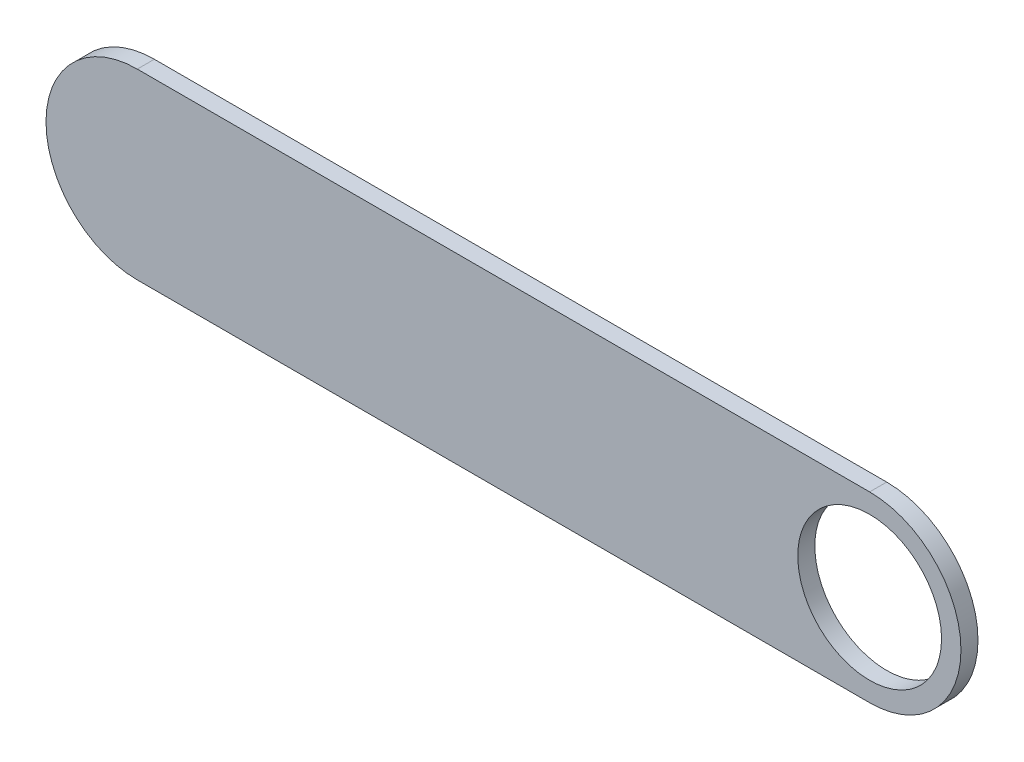
ISO-10303-21;
HEADER;
FILE_DESCRIPTION(('STEP AP214'),'2;1');
FILE_NAME('part.step','',(''),(''),'','','');
FILE_SCHEMA(('AUTOMOTIVE_DESIGN { 1 0 10303 214 1 1 1 1 }'));
ENDSEC;
DATA;
#1=APPLICATION_CONTEXT('core data for automotive mechanical design processes');
#2=APPLICATION_PROTOCOL_DEFINITION('international standard','automotive_design',2000,#1);
#3=PRODUCT_CONTEXT('',#1,'mechanical');
#4=PRODUCT('Part','Part','',(#3));
#5=PRODUCT_RELATED_PRODUCT_CATEGORY('part','',(#4));
#6=PRODUCT_DEFINITION_FORMATION('','',#4);
#7=PRODUCT_DEFINITION_CONTEXT('part definition',#1,'design');
#8=PRODUCT_DEFINITION('design','',#6,#7);
#9=PRODUCT_DEFINITION_SHAPE('','',#8);
#10=(LENGTH_UNIT() NAMED_UNIT(*) SI_UNIT(.MILLI.,.METRE.));
#11=(NAMED_UNIT(*) PLANE_ANGLE_UNIT() SI_UNIT($,.RADIAN.));
#12=(NAMED_UNIT(*) SI_UNIT($,.STERADIAN.) SOLID_ANGLE_UNIT());
#13=UNCERTAINTY_MEASURE_WITH_UNIT(LENGTH_MEASURE(1.E-05),#10,'distance_accuracy_value','');
#14=(GEOMETRIC_REPRESENTATION_CONTEXT(3) GLOBAL_UNCERTAINTY_ASSIGNED_CONTEXT((#13)) GLOBAL_UNIT_ASSIGNED_CONTEXT((#10,
#11,#12)) REPRESENTATION_CONTEXT('',''));
#15=CARTESIAN_POINT('',(0.,0.,0.));
#16=DIRECTION('',(0.,0.,1.));
#17=DIRECTION('',(1.,0.,0.));
#18=AXIS2_PLACEMENT_3D('',#15,#16,#17);
#19=CARTESIAN_POINT('',(25.6499995,12.2555,0.));
#20=DIRECTION('',(0.,1.,0.));
#21=DIRECTION('',(1.,0.,0.));
#22=AXIS2_PLACEMENT_3D('',#19,#20,#21);
#23=PLANE('',#22);
#24=DIRECTION('',(1.,0.,0.));
#25=VECTOR('',#24,1.);
#26=CARTESIAN_POINT('',(25.6499995,12.2555,0.03556));
#27=LINE('',#26,#25);
#28=CARTESIAN_POINT('',(25.6499995,12.2555,0.03556));
#29=VERTEX_POINT('',#28);
#30=CARTESIAN_POINT('',(27.178,12.2555,0.03556));
#31=VERTEX_POINT('',#30);
#32=EDGE_CURVE('E11',#29,#31,#27,.T.);
#33=ORIENTED_EDGE('',*,*,#32,.F.);
#34=DIRECTION('',(0.,0.,1.));
#35=VECTOR('',#34,1.);
#36=CARTESIAN_POINT('',(25.6499995,12.2555,0.));
#37=LINE('',#36,#35);
#38=CARTESIAN_POINT('',(25.6499995,12.2555,0.));
#39=VERTEX_POINT('',#38);
#40=EDGE_CURVE('E23',#39,#29,#37,.T.);
#41=ORIENTED_EDGE('',*,*,#40,.F.);
#42=DIRECTION('',(1.,0.,0.));
#43=VECTOR('',#42,1.);
#44=CARTESIAN_POINT('',(25.6499995,12.2555,0.));
#45=LINE('',#44,#43);
#46=CARTESIAN_POINT('',(27.178,12.2555,0.));
#47=VERTEX_POINT('',#46);
#48=EDGE_CURVE('E95',#39,#47,#45,.T.);
#49=ORIENTED_EDGE('',*,*,#48,.T.);
#50=DIRECTION('',(0.,0.,1.));
#51=VECTOR('',#50,1.);
#52=CARTESIAN_POINT('',(27.178,12.2555,0.));
#53=LINE('',#52,#51);
#54=EDGE_CURVE('E36',#47,#31,#53,.T.);
#55=ORIENTED_EDGE('',*,*,#54,.T.);
#56=EDGE_LOOP('',(#33,#41,#49,#55));
#57=FACE_BOUND('',#56,.T.);
#58=ADVANCED_FACE('F16',(#57),#23,.F.);
#59=CARTESIAN_POINT('',(25.6499995,12.446,0.));
#60=DIRECTION('',(0.,0.,-1.));
#61=DIRECTION('',(0.,1.,0.));
#62=AXIS2_PLACEMENT_3D('',#59,#60,#61);
#63=CYLINDRICAL_SURFACE('',#62,0.1905);
#64=CARTESIAN_POINT('',(25.6499995,12.446,0.03556));
#65=DIRECTION('',(0.,0.,1.));
#66=DIRECTION('',(0.,1.,0.));
#67=AXIS2_PLACEMENT_3D('',#64,#65,#66);
#68=CIRCLE('',#67,0.1905);
#69=CARTESIAN_POINT('',(25.6499995,12.6365,0.03556));
#70=VERTEX_POINT('',#69);
#71=EDGE_CURVE('E91',#70,#29,#68,.T.);
#72=ORIENTED_EDGE('',*,*,#71,.F.);
#73=DIRECTION('',(0.,0.,1.));
#74=VECTOR('',#73,1.);
#75=CARTESIAN_POINT('',(25.6499995,12.6365,0.));
#76=LINE('',#75,#74);
#77=CARTESIAN_POINT('',(25.6499995,12.6365,0.));
#78=VERTEX_POINT('',#77);
#79=EDGE_CURVE('E88',#78,#70,#76,.T.);
#80=ORIENTED_EDGE('',*,*,#79,.F.);
#81=CARTESIAN_POINT('',(25.6499995,12.446,0.));
#82=DIRECTION('',(0.,0.,1.));
#83=DIRECTION('',(0.,1.,0.));
#84=AXIS2_PLACEMENT_3D('',#81,#82,#83);
#85=CIRCLE('',#84,0.1905);
#86=EDGE_CURVE('E86',#78,#39,#85,.T.);
#87=ORIENTED_EDGE('',*,*,#86,.T.);
#88=ORIENTED_EDGE('',*,*,#40,.T.);
#89=EDGE_LOOP('',(#72,#80,#87,#88));
#90=FACE_BOUND('',#89,.T.);
#91=ADVANCED_FACE('F102',(#90),#63,.T.);
#92=CARTESIAN_POINT('',(27.178,12.446,0.));
#93=DIRECTION('',(0.,0.,-1.));
#94=DIRECTION('',(0.,-1.,0.));
#95=AXIS2_PLACEMENT_3D('',#92,#93,#94);
#96=CYLINDRICAL_SURFACE('',#95,0.1905);
#97=CARTESIAN_POINT('',(27.178,12.446,0.03556));
#98=DIRECTION('',(0.,0.,1.));
#99=DIRECTION('',(0.,-1.,0.));
#100=AXIS2_PLACEMENT_3D('',#97,#98,#99);
#101=CIRCLE('',#100,0.1905);
#102=CARTESIAN_POINT('',(27.178,12.6365,0.03556));
#103=VERTEX_POINT('',#102);
#104=EDGE_CURVE('E83',#31,#103,#101,.T.);
#105=ORIENTED_EDGE('',*,*,#104,.F.);
#106=ORIENTED_EDGE('',*,*,#54,.F.);
#107=CARTESIAN_POINT('',(27.178,12.446,0.));
#108=DIRECTION('',(0.,0.,1.));
#109=DIRECTION('',(0.,-1.,0.));
#110=AXIS2_PLACEMENT_3D('',#107,#108,#109);
#111=CIRCLE('',#110,0.1905);
#112=CARTESIAN_POINT('',(27.178,12.6365,0.));
#113=VERTEX_POINT('',#112);
#114=EDGE_CURVE('E80',#47,#113,#111,.T.);
#115=ORIENTED_EDGE('',*,*,#114,.T.);
#116=DIRECTION('',(0.,0.,1.));
#117=VECTOR('',#116,1.);
#118=CARTESIAN_POINT('',(27.178,12.6365,0.));
#119=LINE('',#118,#117);
#120=EDGE_CURVE('E78',#113,#103,#119,.T.);
#121=ORIENTED_EDGE('',*,*,#120,.T.);
#122=EDGE_LOOP('',(#105,#106,#115,#121));
#123=FACE_BOUND('',#122,.T.);
#124=ADVANCED_FACE('F107',(#123),#96,.T.);
#125=CARTESIAN_POINT('',(27.178,12.6365,0.));
#126=DIRECTION('',(0.,-1.,0.));
#127=DIRECTION('',(-1.,0.,0.));
#128=AXIS2_PLACEMENT_3D('',#125,#126,#127);
#129=PLANE('',#128);
#130=DIRECTION('',(-1.,0.,0.));
#131=VECTOR('',#130,1.);
#132=CARTESIAN_POINT('',(27.178,12.6365,0.03556));
#133=LINE('',#132,#131);
#134=EDGE_CURVE('E73',#103,#70,#133,.T.);
#135=ORIENTED_EDGE('',*,*,#134,.F.);
#136=ORIENTED_EDGE('',*,*,#120,.F.);
#137=DIRECTION('',(-1.,0.,0.));
#138=VECTOR('',#137,1.);
#139=CARTESIAN_POINT('',(27.178,12.6365,0.));
#140=LINE('',#139,#138);
#141=EDGE_CURVE('E71',#113,#78,#140,.T.);
#142=ORIENTED_EDGE('',*,*,#141,.T.);
#143=ORIENTED_EDGE('',*,*,#79,.T.);
#144=EDGE_LOOP('',(#135,#136,#142,#143));
#145=FACE_BOUND('',#144,.T.);
#146=ADVANCED_FACE('F105',(#145),#129,.F.);
#147=CARTESIAN_POINT('',(27.178,12.446,0.));
#148=DIRECTION('',(0.,0.,-1.));
#149=DIRECTION('',(1.,0.,0.));
#150=AXIS2_PLACEMENT_3D('',#147,#148,#149);
#151=CYLINDRICAL_SURFACE('',#150,0.1499997);
#152=DIRECTION('',(0.,0.,1.));
#153=VECTOR('',#152,1.);
#154=CARTESIAN_POINT('',(27.3279997,12.446,0.));
#155=LINE('',#154,#153);
#156=CARTESIAN_POINT('',(27.3279997,12.446,0.));
#157=VERTEX_POINT('',#156);
#158=CARTESIAN_POINT('',(27.3279997,12.446,0.03556));
#159=VERTEX_POINT('',#158);
#160=EDGE_CURVE('E68',#157,#159,#155,.T.);
#161=ORIENTED_EDGE('',*,*,#160,.T.);
#162=CARTESIAN_POINT('',(27.178,12.446,0.03556));
#163=DIRECTION('',(0.,0.,1.));
#164=DIRECTION('',(1.,0.,0.));
#165=AXIS2_PLACEMENT_3D('',#162,#163,#164);
#166=CIRCLE('',#165,0.1499997);
#167=EDGE_CURVE('E65',#159,#159,#166,.T.);
#168=ORIENTED_EDGE('',*,*,#167,.T.);
#169=ORIENTED_EDGE('',*,*,#160,.F.);
#170=CARTESIAN_POINT('',(27.178,12.446,0.));
#171=DIRECTION('',(0.,0.,1.));
#172=DIRECTION('',(1.,0.,0.));
#173=AXIS2_PLACEMENT_3D('',#170,#171,#172);
#174=CIRCLE('',#173,0.1499997);
#175=EDGE_CURVE('E61',#157,#157,#174,.T.);
#176=ORIENTED_EDGE('',*,*,#175,.F.);
#177=EDGE_LOOP('',(#161,#168,#169,#176));
#178=FACE_BOUND('',#177,.T.);
#179=ADVANCED_FACE('F69',(#178),#151,.F.);
#180=CARTESIAN_POINT('',(26.41399975,12.446,0.));
#181=DIRECTION('',(0.,0.,1.));
#182=DIRECTION('',(1.,0.,0.));
#183=AXIS2_PLACEMENT_3D('',#180,#181,#182);
#184=PLANE('',#183);
#185=ORIENTED_EDGE('',*,*,#141,.F.);
#186=ORIENTED_EDGE('',*,*,#114,.F.);
#187=ORIENTED_EDGE('',*,*,#48,.F.);
#188=ORIENTED_EDGE('',*,*,#86,.F.);
#189=EDGE_LOOP('',(#185,#186,#187,#188));
#190=FACE_BOUND('',#189,.T.);
#191=ORIENTED_EDGE('',*,*,#175,.T.);
#192=EDGE_LOOP('',(#191));
#193=FACE_BOUND('',#192,.T.);
#194=ADVANCED_FACE('F63',(#190,#193),#184,.F.);
#195=CARTESIAN_POINT('',(26.41399975,12.446,0.03556));
#196=DIRECTION('',(0.,0.,1.));
#197=DIRECTION('',(1.,0.,0.));
#198=AXIS2_PLACEMENT_3D('',#195,#196,#197);
#199=PLANE('',#198);
#200=ORIENTED_EDGE('',*,*,#32,.T.);
#201=ORIENTED_EDGE('',*,*,#104,.T.);
#202=ORIENTED_EDGE('',*,*,#134,.T.);
#203=ORIENTED_EDGE('',*,*,#71,.T.);
#204=EDGE_LOOP('',(#200,#201,#202,#203));
#205=FACE_BOUND('',#204,.T.);
#206=ORIENTED_EDGE('',*,*,#167,.F.);
#207=EDGE_LOOP('',(#206));
#208=FACE_BOUND('',#207,.T.);
#209=ADVANCED_FACE('F109',(#205,#208),#199,.T.);
#210=CLOSED_SHELL('',(#58,#91,#124,#146,#179,#194,#209));
#211=MANIFOLD_SOLID_BREP('B1',#210);
#212=ADVANCED_BREP_SHAPE_REPRESENTATION('',(#18,#211),#14);
#213=SHAPE_DEFINITION_REPRESENTATION(#9,#212);
ENDSEC;
END-ISO-10303-21;
